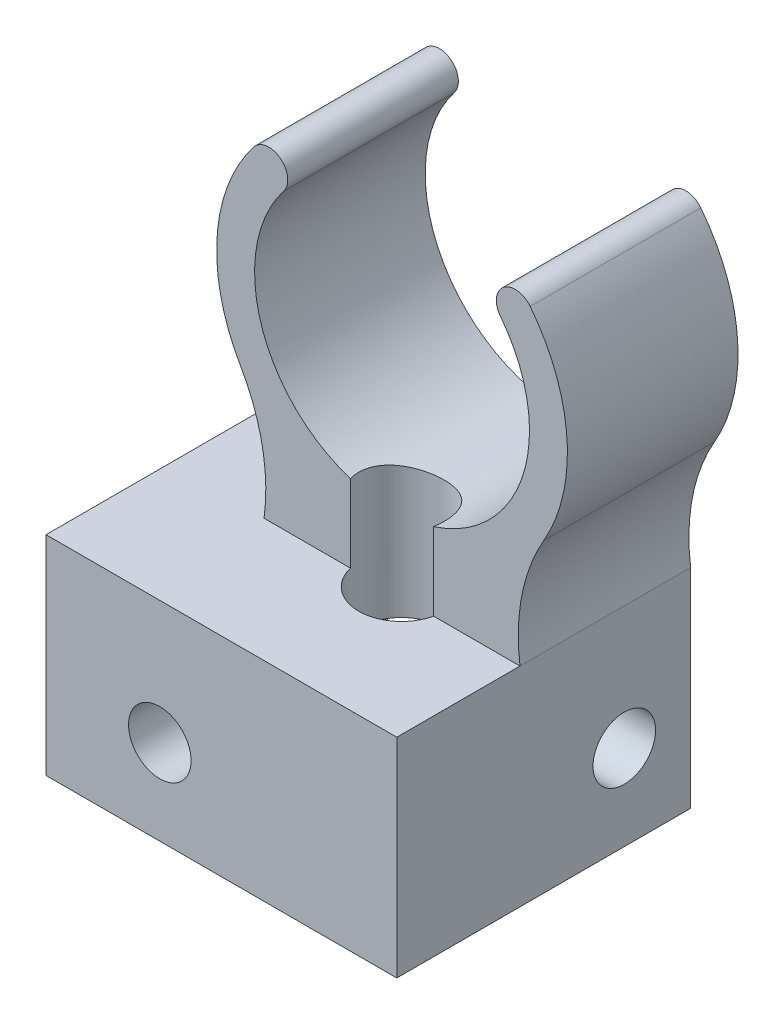
ISO-10303-21;
HEADER;
FILE_DESCRIPTION(('STEP AP214'),'2;1');
FILE_NAME('part.step','',(''),(''),'','','');
FILE_SCHEMA(('AUTOMOTIVE_DESIGN { 1 0 10303 214 1 1 1 1 }'));
ENDSEC;
DATA;
#1=APPLICATION_CONTEXT('core data for automotive mechanical design processes');
#2=APPLICATION_PROTOCOL_DEFINITION('international standard','automotive_design',2000,#1);
#3=PRODUCT_CONTEXT('',#1,'mechanical');
#4=PRODUCT('Part','Part','',(#3));
#5=PRODUCT_RELATED_PRODUCT_CATEGORY('part','',(#4));
#6=PRODUCT_DEFINITION_FORMATION('','',#4);
#7=PRODUCT_DEFINITION_CONTEXT('part definition',#1,'design');
#8=PRODUCT_DEFINITION('design','',#6,#7);
#9=PRODUCT_DEFINITION_SHAPE('','',#8);
#10=(LENGTH_UNIT() NAMED_UNIT(*) SI_UNIT(.MILLI.,.METRE.));
#11=(NAMED_UNIT(*) PLANE_ANGLE_UNIT() SI_UNIT($,.RADIAN.));
#12=(NAMED_UNIT(*) SI_UNIT($,.STERADIAN.) SOLID_ANGLE_UNIT());
#13=UNCERTAINTY_MEASURE_WITH_UNIT(LENGTH_MEASURE(1.E-05),#10,'distance_accuracy_value','');
#14=(GEOMETRIC_REPRESENTATION_CONTEXT(3) GLOBAL_UNCERTAINTY_ASSIGNED_CONTEXT((#13)) GLOBAL_UNIT_ASSIGNED_CONTEXT((#10,
#11,#12)) REPRESENTATION_CONTEXT('',''));
#15=CARTESIAN_POINT('',(0.,0.,0.));
#16=DIRECTION('',(0.,0.,1.));
#17=DIRECTION('',(1.,0.,0.));
#18=AXIS2_PLACEMENT_3D('',#15,#16,#17);
#19=CARTESIAN_POINT('',(5.95456315633577,-4.13590106472685,0.));
#20=DIRECTION('',(0.,0.,-1.));
#21=DIRECTION('',(-1.,0.,0.));
#22=AXIS2_PLACEMENT_3D('',#19,#20,#21);
#23=PLANE('',#22);
#24=DIRECTION('',(0.,1.,0.));
#25=VECTOR('',#24,1.);
#26=CARTESIAN_POINT('',(-2.5,-9.25,0.));
#27=LINE('',#26,#25);
#28=CARTESIAN_POINT('',(-2.5,-12.75,0.));
#29=VERTEX_POINT('',#28);
#30=CARTESIAN_POINT('',(-2.5,-9.25,0.));
#31=VERTEX_POINT('',#30);
#32=EDGE_CURVE('E60',#29,#31,#27,.T.);
#33=ORIENTED_EDGE('',*,*,#32,.F.);
#34=DIRECTION('',(-1.,0.,0.));
#35=VECTOR('',#34,1.);
#36=CARTESIAN_POINT('',(2.5,-12.75,0.));
#37=LINE('',#36,#35);
#38=CARTESIAN_POINT('',(2.5,-12.75,0.));
#39=VERTEX_POINT('',#38);
#40=EDGE_CURVE('E134',#39,#29,#37,.T.);
#41=ORIENTED_EDGE('',*,*,#40,.F.);
#42=DIRECTION('',(0.,-1.,0.));
#43=VECTOR('',#42,1.);
#44=CARTESIAN_POINT('',(2.5,-9.25,0.));
#45=LINE('',#44,#43);
#46=CARTESIAN_POINT('',(2.5,-9.25,0.));
#47=VERTEX_POINT('',#46);
#48=EDGE_CURVE('E510',#47,#39,#45,.T.);
#49=ORIENTED_EDGE('',*,*,#48,.F.);
#50=DIRECTION('',(1.,0.,0.));
#51=VECTOR('',#50,1.);
#52=CARTESIAN_POINT('',(2.5,-9.25,0.));
#53=LINE('',#52,#51);
#54=EDGE_CURVE('E515',#31,#47,#53,.T.);
#55=ORIENTED_EDGE('',*,*,#54,.F.);
#56=EDGE_LOOP('',(#33,#41,#49,#55));
#57=FACE_BOUND('',#56,.T.);
#58=CARTESIAN_POINT('',(-16.6580889761637,-9.64730903735411,0.));
#59=DIRECTION('',(0.,0.,-1.));
#60=DIRECTION('',(-1.,0.,0.));
#61=AXIS2_PLACEMENT_3D('',#58,#59,#60);
#62=CIRCLE('',#61,10.);
#63=CARTESIAN_POINT('',(-6.75,-11.,0.));
#64=VERTEX_POINT('',#63);
#65=CARTESIAN_POINT('',(-8.00453626127346,-4.63571992704029,0.));
#66=VERTEX_POINT('',#65);
#67=EDGE_CURVE('E118',#64,#66,#62,.F.);
#68=ORIENTED_EDGE('',*,*,#67,.T.);
#69=CARTESIAN_POINT('',(0.,0.,0.));
#70=DIRECTION('',(0.,0.,1.));
#71=DIRECTION('',(1.,0.,0.));
#72=AXIS2_PLACEMENT_3D('',#69,#70,#71);
#73=CIRCLE('',#72,9.25);
#74=CARTESIAN_POINT('',(-7.28787878787879,5.69643070467696,0.));
#75=VERTEX_POINT('',#74);
#76=EDGE_CURVE('E162',#75,#66,#73,.T.);
#77=ORIENTED_EDGE('',*,*,#76,.F.);
#78=CARTESIAN_POINT('',(-6.5,5.0806003582254,0.));
#79=DIRECTION('',(0.,0.,1.));
#80=DIRECTION('',(-1.,0.,0.));
#81=AXIS2_PLACEMENT_3D('',#78,#79,#80);
#82=CIRCLE('',#81,1.);
#83=CARTESIAN_POINT('',(-5.71212121212121,4.46477001177383,0.));
#84=VERTEX_POINT('',#83);
#85=EDGE_CURVE('E166',#84,#75,#82,.T.);
#86=ORIENTED_EDGE('',*,*,#85,.F.);
#87=CARTESIAN_POINT('',(0.,0.,0.));
#88=DIRECTION('',(0.,0.,-1.));
#89=DIRECTION('',(1.,0.,0.));
#90=AXIS2_PLACEMENT_3D('',#87,#88,#89);
#91=CIRCLE('',#90,7.25);
#92=CARTESIAN_POINT('',(5.71212121212121,4.46477001177383,0.));
#93=VERTEX_POINT('',#92);
#94=EDGE_CURVE('E155',#93,#84,#91,.T.);
#95=ORIENTED_EDGE('',*,*,#94,.F.);
#96=CARTESIAN_POINT('',(6.5,5.0806003582254,0.));
#97=DIRECTION('',(0.,0.,1.));
#98=DIRECTION('',(1.,0.,0.));
#99=AXIS2_PLACEMENT_3D('',#96,#97,#98);
#100=CIRCLE('',#99,1.);
#101=CARTESIAN_POINT('',(7.28787878787879,5.69643070467696,0.));
#102=VERTEX_POINT('',#101);
#103=EDGE_CURVE('E158',#102,#93,#100,.T.);
#104=ORIENTED_EDGE('',*,*,#103,.F.);
#105=CARTESIAN_POINT('',(8.00453626127346,-4.63571992704029,0.));
#106=VERTEX_POINT('',#105);
#107=EDGE_CURVE('E165',#106,#102,#73,.T.);
#108=ORIENTED_EDGE('',*,*,#107,.F.);
#109=CARTESIAN_POINT('',(16.6580889761637,-9.64730903735411,0.));
#110=DIRECTION('',(0.,0.,-1.));
#111=DIRECTION('',(-1.,0.,0.));
#112=AXIS2_PLACEMENT_3D('',#109,#110,#111);
#113=CIRCLE('',#112,10.);
#114=CARTESIAN_POINT('',(6.75,-11.,0.));
#115=VERTEX_POINT('',#114);
#116=EDGE_CURVE('E109',#106,#115,#113,.F.);
#117=ORIENTED_EDGE('',*,*,#116,.T.);
#118=DIRECTION('',(0.,1.,0.));
#119=VECTOR('',#118,1.);
#120=CARTESIAN_POINT('',(6.75,-11.,0.));
#121=LINE('',#120,#119);
#122=CARTESIAN_POINT('',(6.75,-22.,0.));
#123=VERTEX_POINT('',#122);
#124=EDGE_CURVE('E90',#123,#115,#121,.T.);
#125=ORIENTED_EDGE('',*,*,#124,.F.);
#126=DIRECTION('',(-1.,0.,0.));
#127=VECTOR('',#126,1.);
#128=CARTESIAN_POINT('',(6.75,-22.,0.));
#129=LINE('',#128,#127);
#130=CARTESIAN_POINT('',(4.25,-22.,0.));
#131=VERTEX_POINT('',#130);
#132=EDGE_CURVE('E97',#123,#131,#129,.T.);
#133=ORIENTED_EDGE('',*,*,#132,.T.);
#134=DIRECTION('',(0.,1.,0.));
#135=VECTOR('',#134,1.);
#136=CARTESIAN_POINT('',(4.25,-11.,0.));
#137=LINE('',#136,#135);
#138=CARTESIAN_POINT('',(4.25,-14.,0.));
#139=VERTEX_POINT('',#138);
#140=EDGE_CURVE('E114',#131,#139,#137,.T.);
#141=ORIENTED_EDGE('',*,*,#140,.T.);
#142=DIRECTION('',(1.,0.,0.));
#143=VECTOR('',#142,1.);
#144=CARTESIAN_POINT('',(-9.25,-14.,0.));
#145=LINE('',#144,#143);
#146=CARTESIAN_POINT('',(-9.25,-14.,0.));
#147=VERTEX_POINT('',#146);
#148=EDGE_CURVE('E194',#147,#139,#145,.T.);
#149=ORIENTED_EDGE('',*,*,#148,.F.);
#150=DIRECTION('',(0.,-1.,0.));
#151=VECTOR('',#150,1.);
#152=CARTESIAN_POINT('',(-9.25,-11.,0.));
#153=LINE('',#152,#151);
#154=CARTESIAN_POINT('',(-9.25,-22.,0.));
#155=VERTEX_POINT('',#154);
#156=EDGE_CURVE('E393',#147,#155,#153,.T.);
#157=ORIENTED_EDGE('',*,*,#156,.T.);
#158=DIRECTION('',(1.,0.,0.));
#159=VECTOR('',#158,1.);
#160=CARTESIAN_POINT('',(-11.75,-22.,0.));
#161=LINE('',#160,#159);
#162=CARTESIAN_POINT('',(-11.75,-22.,0.));
#163=VERTEX_POINT('',#162);
#164=EDGE_CURVE('E408',#163,#155,#161,.T.);
#165=ORIENTED_EDGE('',*,*,#164,.F.);
#166=DIRECTION('',(0.,-1.,0.));
#167=VECTOR('',#166,1.);
#168=CARTESIAN_POINT('',(-11.75,-11.,0.));
#169=LINE('',#168,#167);
#170=CARTESIAN_POINT('',(-11.75,-11.,0.));
#171=VERTEX_POINT('',#170);
#172=EDGE_CURVE('E400',#171,#163,#169,.T.);
#173=ORIENTED_EDGE('',*,*,#172,.F.);
#174=DIRECTION('',(1.,0.,0.));
#175=VECTOR('',#174,1.);
#176=CARTESIAN_POINT('',(-9.25,-11.,0.));
#177=LINE('',#176,#175);
#178=EDGE_CURVE('E201',#171,#64,#177,.T.);
#179=ORIENTED_EDGE('',*,*,#178,.T.);
#180=EDGE_LOOP('',(#68,#77,#86,#95,#104,#108,#117,#125,#133,#141,#149,#157,#165,#173,#179));
#181=FACE_BOUND('',#180,.T.);
#182=ADVANCED_FACE('F43',(#57,#181),#23,.T.);
#183=CARTESIAN_POINT('',(-5.75,-17.5,15.5));
#184=DIRECTION('',(0.,0.,-1.));
#185=DIRECTION('',(-1.,0.,0.));
#186=AXIS2_PLACEMENT_3D('',#183,#184,#185);
#187=CYLINDRICAL_SURFACE('',#186,1.65);
#188=CARTESIAN_POINT('',(-5.75,-17.5,15.5));
#189=DIRECTION('',(0.,0.,1.));
#190=DIRECTION('',(1.,0.,0.));
#191=AXIS2_PLACEMENT_3D('',#188,#189,#190);
#192=CIRCLE('',#191,1.65);
#193=CARTESIAN_POINT('',(-4.1,-17.5,15.5));
#194=VERTEX_POINT('',#193);
#195=EDGE_CURVE('E414',#194,#194,#192,.T.);
#196=ORIENTED_EDGE('',*,*,#195,.T.);
#197=EDGE_LOOP('',(#196));
#198=FACE_BOUND('',#197,.T.);
#199=CARTESIAN_POINT('',(-5.75,-17.5,13.));
#200=DIRECTION('',(0.,0.,1.));
#201=DIRECTION('',(1.,0.,0.));
#202=AXIS2_PLACEMENT_3D('',#199,#200,#201);
#203=CIRCLE('',#202,1.65);
#204=CARTESIAN_POINT('',(-4.1,-17.5,13.));
#205=VERTEX_POINT('',#204);
#206=EDGE_CURVE('E378',#205,#205,#203,.T.);
#207=ORIENTED_EDGE('',*,*,#206,.F.);
#208=EDGE_LOOP('',(#207));
#209=FACE_BOUND('',#208,.T.);
#210=ADVANCED_FACE('F229',(#198,#209),#187,.F.);
#211=CARTESIAN_POINT('',(16.6580889761637,-9.64730903735411,-5.35));
#212=DIRECTION('',(0.,0.,1.));
#213=DIRECTION('',(1.,0.,0.));
#214=AXIS2_PLACEMENT_3D('',#211,#212,#213);
#215=CYLINDRICAL_SURFACE('',#214,10.);
#216=ORIENTED_EDGE('',*,*,#116,.F.);
#217=DIRECTION('',(0.,0.,1.));
#218=VECTOR('',#217,1.);
#219=CARTESIAN_POINT('',(8.00453626127346,-4.63571992704029,-17.2277236998751));
#220=LINE('',#219,#218);
#221=CARTESIAN_POINT('',(8.00453626127346,-4.63571992704029,9.));
#222=VERTEX_POINT('',#221);
#223=EDGE_CURVE('E185',#106,#222,#220,.T.);
#224=ORIENTED_EDGE('',*,*,#223,.T.);
#225=CARTESIAN_POINT('',(16.6580889761637,-9.64730903735411,9.));
#226=DIRECTION('',(0.,0.,-1.));
#227=DIRECTION('',(-1.,0.,0.));
#228=AXIS2_PLACEMENT_3D('',#225,#226,#227);
#229=CIRCLE('',#228,10.);
#230=CARTESIAN_POINT('',(6.75,-11.,9.));
#231=VERTEX_POINT('',#230);
#232=EDGE_CURVE('E188',#231,#222,#229,.T.);
#233=ORIENTED_EDGE('',*,*,#232,.F.);
#234=DIRECTION('',(0.,0.,1.));
#235=VECTOR('',#234,1.);
#236=CARTESIAN_POINT('',(6.75,-11.,-5.35));
#237=LINE('',#236,#235);
#238=EDGE_CURVE('E47',#115,#231,#237,.T.);
#239=ORIENTED_EDGE('',*,*,#238,.F.);
#240=EDGE_LOOP('',(#216,#224,#233,#239));
#241=FACE_BOUND('',#240,.T.);
#242=ADVANCED_FACE('F232',(#241),#215,.F.);
#243=CARTESIAN_POINT('',(-6.5,5.0806003582254,9.));
#244=DIRECTION('',(0.,0.,-1.));
#245=DIRECTION('',(-1.,0.,0.));
#246=AXIS2_PLACEMENT_3D('',#243,#244,#245);
#247=CYLINDRICAL_SURFACE('',#246,1.);
#248=ORIENTED_EDGE('',*,*,#85,.T.);
#249=DIRECTION('',(0.,0.,-1.));
#250=VECTOR('',#249,1.);
#251=CARTESIAN_POINT('',(-7.28787878787879,5.69643070467696,9.));
#252=LINE('',#251,#250);
#253=CARTESIAN_POINT('',(-7.28787878787879,5.69643070467696,9.));
#254=VERTEX_POINT('',#253);
#255=EDGE_CURVE('E142',#254,#75,#252,.T.);
#256=ORIENTED_EDGE('',*,*,#255,.F.);
#257=CARTESIAN_POINT('',(-6.5,5.0806003582254,9.));
#258=DIRECTION('',(0.,0.,1.));
#259=DIRECTION('',(-1.,0.,0.));
#260=AXIS2_PLACEMENT_3D('',#257,#258,#259);
#261=CIRCLE('',#260,1.);
#262=CARTESIAN_POINT('',(-5.71212121212121,4.46477001177383,9.));
#263=VERTEX_POINT('',#262);
#264=EDGE_CURVE('E159',#263,#254,#261,.T.);
#265=ORIENTED_EDGE('',*,*,#264,.F.);
#266=DIRECTION('',(0.,0.,-1.));
#267=VECTOR('',#266,1.);
#268=CARTESIAN_POINT('',(-5.71212121212121,4.46477001177383,9.));
#269=LINE('',#268,#267);
#270=EDGE_CURVE('E151',#263,#84,#269,.T.);
#271=ORIENTED_EDGE('',*,*,#270,.T.);
#272=EDGE_LOOP('',(#248,#256,#265,#271));
#273=FACE_BOUND('',#272,.T.);
#274=ADVANCED_FACE('F273',(#273),#247,.T.);
#275=CARTESIAN_POINT('',(0.,0.,9.));
#276=DIRECTION('',(0.,0.,-1.));
#277=DIRECTION('',(-1.,0.,0.));
#278=AXIS2_PLACEMENT_3D('',#275,#276,#277);
#279=CYLINDRICAL_SURFACE('',#278,9.25);
#280=ORIENTED_EDGE('',*,*,#223,.F.);
#281=ORIENTED_EDGE('',*,*,#107,.T.);
#282=DIRECTION('',(0.,0.,-1.));
#283=VECTOR('',#282,1.);
#284=CARTESIAN_POINT('',(7.28787878787879,5.69643070467696,9.));
#285=LINE('',#284,#283);
#286=CARTESIAN_POINT('',(7.28787878787879,5.69643070467696,9.));
#287=VERTEX_POINT('',#286);
#288=EDGE_CURVE('E145',#287,#102,#285,.T.);
#289=ORIENTED_EDGE('',*,*,#288,.F.);
#290=CARTESIAN_POINT('',(0.,0.,9.));
#291=DIRECTION('',(0.,0.,1.));
#292=DIRECTION('',(1.,0.,0.));
#293=AXIS2_PLACEMENT_3D('',#290,#291,#292);
#294=CIRCLE('',#293,9.25);
#295=EDGE_CURVE('E179',#222,#287,#294,.T.);
#296=ORIENTED_EDGE('',*,*,#295,.F.);
#297=EDGE_LOOP('',(#280,#281,#289,#296));
#298=FACE_BOUND('',#297,.T.);
#299=ADVANCED_FACE('F284',(#298),#279,.T.);
#300=CARTESIAN_POINT('',(-16.6580889761637,-9.64730903735411,-5.35));
#301=DIRECTION('',(0.,0.,1.));
#302=DIRECTION('',(1.,0.,0.));
#303=AXIS2_PLACEMENT_3D('',#300,#301,#302);
#304=CYLINDRICAL_SURFACE('',#303,10.);
#305=ORIENTED_EDGE('',*,*,#67,.F.);
#306=DIRECTION('',(0.,0.,1.));
#307=VECTOR('',#306,1.);
#308=CARTESIAN_POINT('',(-6.75,-11.,-17.2277236998751));
#309=LINE('',#308,#307);
#310=CARTESIAN_POINT('',(-6.75,-11.,9.));
#311=VERTEX_POINT('',#310);
#312=EDGE_CURVE('E169',#64,#311,#309,.T.);
#313=ORIENTED_EDGE('',*,*,#312,.T.);
#314=CARTESIAN_POINT('',(-16.6580889761637,-9.64730903735412,9.));
#315=DIRECTION('',(0.,0.,-1.));
#316=DIRECTION('',(1.,0.,0.));
#317=AXIS2_PLACEMENT_3D('',#314,#315,#316);
#318=CIRCLE('',#317,10.);
#319=CARTESIAN_POINT('',(-8.00453626127346,-4.63571992704029,9.));
#320=VERTEX_POINT('',#319);
#321=EDGE_CURVE('E191',#320,#311,#318,.T.);
#322=ORIENTED_EDGE('',*,*,#321,.F.);
#323=DIRECTION('',(0.,0.,1.));
#324=VECTOR('',#323,1.);
#325=CARTESIAN_POINT('',(-8.00453626127346,-4.63571992704029,-17.2277236998751));
#326=LINE('',#325,#324);
#327=EDGE_CURVE('E184',#66,#320,#326,.T.);
#328=ORIENTED_EDGE('',*,*,#327,.F.);
#329=EDGE_LOOP('',(#305,#313,#322,#328));
#330=FACE_BOUND('',#329,.T.);
#331=ADVANCED_FACE('F281',(#330),#304,.F.);
#332=CARTESIAN_POINT('',(-3.25,2.5403001791127,9.));
#333=DIRECTION('',(0.,0.,-1.));
#334=DIRECTION('',(-1.,0.,0.));
#335=AXIS2_PLACEMENT_3D('',#332,#333,#334);
#336=PLANE('',#335);
#337=DIRECTION('',(1.,0.,0.));
#338=VECTOR('',#337,1.);
#339=CARTESIAN_POINT('',(-6.75,-11.,9.));
#340=LINE('',#339,#338);
#341=CARTESIAN_POINT('',(-2.19374109684803,-11.,9.));
#342=VERTEX_POINT('',#341);
#343=EDGE_CURVE('E196',#311,#342,#340,.T.);
#344=ORIENTED_EDGE('',*,*,#343,.T.);
#345=DIRECTION('',(0.,-1.,0.));
#346=VECTOR('',#345,1.);
#347=CARTESIAN_POINT('',(-2.19374109684803,6.0816003582254,9.));
#348=LINE('',#347,#346);
#349=CARTESIAN_POINT('',(-2.19374109684803,-6.91013748054263,9.));
#350=VERTEX_POINT('',#349);
#351=EDGE_CURVE('E431',#350,#342,#348,.T.);
#352=ORIENTED_EDGE('',*,*,#351,.F.);
#353=CARTESIAN_POINT('',(0.,0.,9.));
#354=DIRECTION('',(0.,0.,-1.));
#355=DIRECTION('',(1.,0.,0.));
#356=AXIS2_PLACEMENT_3D('',#353,#354,#355);
#357=CIRCLE('',#356,7.25);
#358=EDGE_CURVE('E172',#350,#263,#357,.T.);
#359=ORIENTED_EDGE('',*,*,#358,.T.);
#360=ORIENTED_EDGE('',*,*,#264,.T.);
#361=EDGE_CURVE('E176',#254,#320,#294,.T.);
#362=ORIENTED_EDGE('',*,*,#361,.T.);
#363=ORIENTED_EDGE('',*,*,#321,.T.);
#364=EDGE_LOOP('',(#344,#352,#359,#360,#362,#363));
#365=FACE_BOUND('',#364,.T.);
#366=ADVANCED_FACE('F283',(#365),#336,.F.);
#367=CARTESIAN_POINT('',(0.,6.0816003582254,8.5));
#368=DIRECTION('',(0.,-1.,0.));
#369=DIRECTION('',(1.,0.,0.));
#370=AXIS2_PLACEMENT_3D('',#367,#368,#369);
#371=CYLINDRICAL_SURFACE('',#370,2.25);
#372=CARTESIAN_POINT('',(0.,-14.,8.5));
#373=DIRECTION('',(0.,-1.,0.));
#374=DIRECTION('',(1.,0.,0.));
#375=AXIS2_PLACEMENT_3D('',#372,#373,#374);
#376=CIRCLE('',#375,2.25);
#377=CARTESIAN_POINT('',(2.25,-14.,8.5));
#378=VERTEX_POINT('',#377);
#379=EDGE_CURVE('E422',#378,#378,#376,.T.);
#380=ORIENTED_EDGE('',*,*,#379,.T.);
#381=EDGE_LOOP('',(#380));
#382=FACE_BOUND('',#381,.T.);
#383=CARTESIAN_POINT('',(2.19374109684803,-6.91013748054263,9.));
#384=CARTESIAN_POINT('',(2.2071878763264,-6.9058629545295,8.94103464728746));
#385=CARTESIAN_POINT('',(2.21825467540277,-6.90231180586618,8.88147405945985));
#386=CARTESIAN_POINT('',(2.23556086648634,-6.89672899914491,8.76158668351088));
#387=CARTESIAN_POINT('',(2.24180034541183,-6.89469731372831,8.70125990920496));
#388=CARTESIAN_POINT('',(2.24937751265604,-6.89222842998436,8.58038074963204));
#389=CARTESIAN_POINT('',(2.25072477610182,-6.89178811700383,8.51982903751698));
#390=CARTESIAN_POINT('',(2.24854021946834,-6.89250056624851,8.3988413907536));
#391=CARTESIAN_POINT('',(2.24500857488242,-6.89365327117318,8.33840545201923));
#392=CARTESIAN_POINT('',(2.22711131276882,-6.8994690686885,8.15784313406396));
#393=CARTESIAN_POINT('',(2.20544561432265,-6.90648912581003,8.03842582895325));
#394=CARTESIAN_POINT('',(2.14341369870189,-6.92598797234484,7.8051042488775));
#395=CARTESIAN_POINT('',(2.10304581068597,-6.9384672494757,7.69120046749146));
#396=CARTESIAN_POINT('',(2.0042850304718,-6.96764052720252,7.47036666976525));
#397=CARTESIAN_POINT('',(1.94567588259289,-6.98438463127149,7.36354003961246));
#398=CARTESIAN_POINT('',(1.81223415359198,-7.02019005558939,7.16095755265948));
#399=CARTESIAN_POINT('',(1.73739491442136,-7.03925232540252,7.06520626407372));
#400=CARTESIAN_POINT('',(1.56966027231202,-7.07858741220667,6.88300492764522));
#401=CARTESIAN_POINT('',(1.47610647473906,-7.09887621681128,6.79716325417896));
#402=CARTESIAN_POINT('',(1.27566835087453,-7.13761686654392,6.64225599134772));
#403=CARTESIAN_POINT('',(1.16878416702953,-7.15606873129743,6.5731902227411));
#404=CARTESIAN_POINT('',(0.943668275370852,-7.18922823367605,6.45345536238316));
#405=CARTESIAN_POINT('',(0.825365824017812,-7.20391015250896,6.40291168067875));
#406=CARTESIAN_POINT('',(0.581373549995906,-7.22769004812993,6.32261942364704));
#407=CARTESIAN_POINT('',(0.455685785187521,-7.23678957239982,6.29286508503919));
#408=CARTESIAN_POINT('',(0.205688950473652,-7.24812006625545,6.25599934999144));
#409=CARTESIAN_POINT('',(0.0815130760723774,-7.25060196852546,6.24806036601382));
#410=CARTESIAN_POINT('',(-0.166401582241811,-7.24914954463106,6.25274037825404));
#411=CARTESIAN_POINT('',(-0.29014042443023,-7.24521610898573,6.26535652119519));
#412=CARTESIAN_POINT('',(-0.530622807088502,-7.23153612575385,6.31012587905792));
#413=CARTESIAN_POINT('',(-0.647462655723476,-7.22192967739154,6.34180857930247));
#414=CARTESIAN_POINT('',(-0.874139151738475,-7.19801234550353,6.42325010579229));
#415=CARTESIAN_POINT('',(-0.983975071701241,-7.18370097427884,6.47301080600812));
#416=CARTESIAN_POINT('',(-1.19655794980648,-7.15140569444166,6.59058414432288));
#417=CARTESIAN_POINT('',(-1.29906101521033,-7.13333938308196,6.65881452786711));
#418=CARTESIAN_POINT('',(-1.49144817577087,-7.09561203539172,6.81087975440779));
#419=CARTESIAN_POINT('',(-1.58132795507123,-7.07595045725245,6.89471991165568));
#420=CARTESIAN_POINT('',(-1.74952125450974,-7.03629441059367,7.07948005877561));
#421=CARTESIAN_POINT('',(-1.82725078623368,-7.01631661939576,7.18093647789479));
#422=CARTESIAN_POINT('',(-1.96461056635269,-6.97910361312422,7.39588637529811));
#423=CARTESIAN_POINT('',(-2.02424412331603,-6.96186789697919,7.50937764806924));
#424=CARTESIAN_POINT('',(-2.12330312409141,-6.93229820738975,7.74481242956322));
#425=CARTESIAN_POINT('',(-2.16282751026598,-6.91994030259355,7.86671113659563));
#426=CARTESIAN_POINT('',(-2.22065402232908,-6.90160409861676,8.11589529870101));
#427=CARTESIAN_POINT('',(-2.23896458751105,-6.89562326258281,8.2431785907733));
#428=CARTESIAN_POINT('',(-2.25235578715861,-6.89125641454198,8.47655675306101));
#429=CARTESIAN_POINT('',(-2.25095997114261,-6.89171823352986,8.58243486197695));
#430=CARTESIAN_POINT('',(-2.23776924472285,-6.8960062664288,8.74017131413235));
#431=CARTESIAN_POINT('',(-2.23151735311219,-6.89803660659588,8.79259409576107));
#432=CARTESIAN_POINT('',(-2.21535842229283,-6.90324216898914,8.89682293197231));
#433=CARTESIAN_POINT('',(-2.20545091732476,-6.90641753710142,8.94862890709932));
#434=CARTESIAN_POINT('',(-2.19374109684803,-6.91013748054263,9.));
#435=B_SPLINE_CURVE_WITH_KNOTS('',3,(#383,#384,#385,#386,#387,#388,#389,#390,#391,#392,#393,
#394,#395,#396,#397,#398,#399,#400,#401,#402,#403,#404,#405,#406,#407,#408,#409,#410,#411,#412,
#413,#414,#415,#416,#417,#418,#419,#420,#421,#422,#423,#424,#425,#426,#427,#428,#429,#430,#431,
#432,#433,#434),.UNSPECIFIED.,.F.,.F.,(4,2,2,2,2,2,2,2,2,2,2,2,2,2,2,2,2,2,2,2,2,2,2,2,2,4),(0.,
0.181836072470973,0.363668870817822,0.545145590523874,0.726615782719335,1.08944806590521,
1.45231277054131,1.81965467529651,2.18714756025137,2.5710938922725,2.95503612185023,
3.34153192276339,3.72792053565914,4.0994343710233,4.4708966405924,4.83354788041264,
5.19623672349374,5.56793566380874,5.93976137889858,6.32601210561999,6.71219216977942,
7.09645329224342,7.48056149519752,7.79701470389792,7.95538840729058,8.11378229594751),.UNSPECIFIED.);
#436=CARTESIAN_POINT('',(2.19374109684803,-6.91013748054263,9.));
#437=VERTEX_POINT('',#436);
#438=EDGE_CURVE('E203',#437,#350,#435,.T.);
#439=ORIENTED_EDGE('',*,*,#438,.T.);
#440=ORIENTED_EDGE('',*,*,#351,.T.);
#441=CARTESIAN_POINT('',(0.,-11.,8.5));
#442=DIRECTION('',(0.,-1.,0.));
#443=DIRECTION('',(1.,0.,0.));
#444=AXIS2_PLACEMENT_3D('',#441,#442,#443);
#445=CIRCLE('',#444,2.25);
#446=CARTESIAN_POINT('',(2.19374109684803,-11.,9.));
#447=VERTEX_POINT('',#446);
#448=EDGE_CURVE('E429',#342,#447,#445,.F.);
#449=ORIENTED_EDGE('',*,*,#448,.T.);
#450=DIRECTION('',(0.,-1.,0.));
#451=VECTOR('',#450,1.);
#452=CARTESIAN_POINT('',(2.19374109684803,6.0816003582254,9.));
#453=LINE('',#452,#451);
#454=EDGE_CURVE('E222',#447,#437,#453,.F.);
#455=ORIENTED_EDGE('',*,*,#454,.T.);
#456=EDGE_LOOP('',(#439,#440,#449,#455));
#457=FACE_BOUND('',#456,.T.);
#458=ADVANCED_FACE('F224',(#382,#457),#371,.F.);
#459=CARTESIAN_POINT('',(5.71212121212121,4.46477001177383,9.));
#460=VERTEX_POINT('',#459);
#461=EDGE_CURVE('E154',#460,#437,#357,.T.);
#462=ORIENTED_EDGE('',*,*,#461,.T.);
#463=ORIENTED_EDGE('',*,*,#454,.F.);
#464=EDGE_CURVE('E195',#447,#231,#340,.T.);
#465=ORIENTED_EDGE('',*,*,#464,.T.);
#466=ORIENTED_EDGE('',*,*,#232,.T.);
#467=ORIENTED_EDGE('',*,*,#295,.T.);
#468=CARTESIAN_POINT('',(6.5,5.0806003582254,9.));
#469=DIRECTION('',(0.,0.,1.));
#470=DIRECTION('',(1.,0.,0.));
#471=AXIS2_PLACEMENT_3D('',#468,#469,#470);
#472=CIRCLE('',#471,1.);
#473=EDGE_CURVE('E173',#287,#460,#472,.T.);
#474=ORIENTED_EDGE('',*,*,#473,.T.);
#475=EDGE_LOOP('',(#462,#463,#465,#466,#467,#474));
#476=FACE_BOUND('',#475,.T.);
#477=ADVANCED_FACE('F277',(#476),#336,.F.);
#478=CARTESIAN_POINT('',(6.75,-11.,-5.35));
#479=DIRECTION('',(-1.,0.,0.));
#480=DIRECTION('',(0.,0.,1.));
#481=AXIS2_PLACEMENT_3D('',#478,#479,#480);
#482=PLANE('',#481);
#483=CARTESIAN_POINT('',(6.75,-17.5,3.5));
#484=DIRECTION('',(1.,0.,0.));
#485=DIRECTION('',(0.,1.,0.));
#486=AXIS2_PLACEMENT_3D('',#483,#484,#485);
#487=CIRCLE('',#486,1.65);
#488=CARTESIAN_POINT('',(6.75,-15.85,3.5));
#489=VERTEX_POINT('',#488);
#490=EDGE_CURVE('E52',#489,#489,#487,.T.);
#491=ORIENTED_EDGE('',*,*,#490,.F.);
#492=EDGE_LOOP('',(#491));
#493=FACE_BOUND('',#492,.T.);
#494=ORIENTED_EDGE('',*,*,#124,.T.);
#495=ORIENTED_EDGE('',*,*,#238,.T.);
#496=DIRECTION('',(0.,0.,1.));
#497=VECTOR('',#496,1.);
#498=CARTESIAN_POINT('',(6.75,-11.,15.5));
#499=LINE('',#498,#497);
#500=CARTESIAN_POINT('',(6.75,-11.,15.5));
#501=VERTEX_POINT('',#500);
#502=EDGE_CURVE('E102',#231,#501,#499,.T.);
#503=ORIENTED_EDGE('',*,*,#502,.T.);
#504=DIRECTION('',(0.,-1.,0.));
#505=VECTOR('',#504,1.);
#506=CARTESIAN_POINT('',(6.75,-11.,15.5));
#507=LINE('',#506,#505);
#508=CARTESIAN_POINT('',(6.75,-22.,15.5));
#509=VERTEX_POINT('',#508);
#510=EDGE_CURVE('E94',#501,#509,#507,.T.);
#511=ORIENTED_EDGE('',*,*,#510,.T.);
#512=DIRECTION('',(0.,0.,-1.));
#513=VECTOR('',#512,1.);
#514=CARTESIAN_POINT('',(6.75,-22.,15.5));
#515=LINE('',#514,#513);
#516=EDGE_CURVE('E85',#509,#123,#515,.T.);
#517=ORIENTED_EDGE('',*,*,#516,.T.);
#518=EDGE_LOOP('',(#494,#495,#503,#511,#517));
#519=FACE_BOUND('',#518,.T.);
#520=ADVANCED_FACE('F86',(#493,#519),#482,.F.);
#521=CARTESIAN_POINT('',(0.,0.,15.5));
#522=DIRECTION('',(0.,0.,1.));
#523=DIRECTION('',(1.,0.,0.));
#524=AXIS2_PLACEMENT_3D('',#521,#522,#523);
#525=PLANE('',#524);
#526=ORIENTED_EDGE('',*,*,#195,.F.);
#527=EDGE_LOOP('',(#526));
#528=FACE_BOUND('',#527,.T.);
#529=DIRECTION('',(1.,0.,0.));
#530=VECTOR('',#529,1.);
#531=CARTESIAN_POINT('',(0.,-22.,15.5));
#532=LINE('',#531,#530);
#533=CARTESIAN_POINT('',(-11.75,-22.,15.5));
#534=VERTEX_POINT('',#533);
#535=EDGE_CURVE('E420',#534,#509,#532,.T.);
#536=ORIENTED_EDGE('',*,*,#535,.T.);
#537=ORIENTED_EDGE('',*,*,#510,.F.);
#538=DIRECTION('',(-1.,0.,0.));
#539=VECTOR('',#538,1.);
#540=CARTESIAN_POINT('',(0.,-11.,15.5));
#541=LINE('',#540,#539);
#542=CARTESIAN_POINT('',(-11.75,-11.,15.5));
#543=VERTEX_POINT('',#542);
#544=EDGE_CURVE('E418',#501,#543,#541,.T.);
#545=ORIENTED_EDGE('',*,*,#544,.T.);
#546=DIRECTION('',(0.,1.,0.));
#547=VECTOR('',#546,1.);
#548=CARTESIAN_POINT('',(-11.75,-11.,15.5));
#549=LINE('',#548,#547);
#550=EDGE_CURVE('E405',#534,#543,#549,.T.);
#551=ORIENTED_EDGE('',*,*,#550,.F.);
#552=EDGE_LOOP('',(#536,#537,#545,#551));
#553=FACE_BOUND('',#552,.T.);
#554=ADVANCED_FACE('F242',(#528,#553),#525,.T.);
#555=CARTESIAN_POINT('',(-11.75,-17.5,3.5));
#556=DIRECTION('',(1.,0.,0.));
#557=DIRECTION('',(0.,1.,0.));
#558=AXIS2_PLACEMENT_3D('',#555,#556,#557);
#559=CYLINDRICAL_SURFACE('',#558,1.65);
#560=CARTESIAN_POINT('',(-11.75,-17.5,3.5));
#561=DIRECTION('',(-1.,0.,0.));
#562=DIRECTION('',(0.,-1.,0.));
#563=AXIS2_PLACEMENT_3D('',#560,#561,#562);
#564=CIRCLE('',#563,1.65);
#565=CARTESIAN_POINT('',(-11.75,-19.15,3.5));
#566=VERTEX_POINT('',#565);
#567=EDGE_CURVE('E390',#566,#566,#564,.T.);
#568=ORIENTED_EDGE('',*,*,#567,.T.);
#569=EDGE_LOOP('',(#568));
#570=FACE_BOUND('',#569,.T.);
#571=CARTESIAN_POINT('',(-9.25,-17.5,3.5));
#572=DIRECTION('',(-1.,0.,0.));
#573=DIRECTION('',(0.,-1.,0.));
#574=AXIS2_PLACEMENT_3D('',#571,#572,#573);
#575=CIRCLE('',#574,1.65);
#576=CARTESIAN_POINT('',(-9.25,-19.15,3.5));
#577=VERTEX_POINT('',#576);
#578=EDGE_CURVE('E103',#577,#577,#575,.T.);
#579=ORIENTED_EDGE('',*,*,#578,.F.);
#580=EDGE_LOOP('',(#579));
#581=FACE_BOUND('',#580,.T.);
#582=ADVANCED_FACE('F245',(#570,#581),#559,.F.);
#583=CARTESIAN_POINT('',(6.75,-17.5,3.5));
#584=DIRECTION('',(-1.,0.,0.));
#585=DIRECTION('',(0.,-1.,0.));
#586=AXIS2_PLACEMENT_3D('',#583,#584,#585);
#587=CYLINDRICAL_SURFACE('',#586,1.65);
#588=ORIENTED_EDGE('',*,*,#490,.T.);
#589=EDGE_LOOP('',(#588));
#590=FACE_BOUND('',#589,.T.);
#591=CARTESIAN_POINT('',(4.25,-17.5,3.5));
#592=DIRECTION('',(1.,0.,0.));
#593=DIRECTION('',(0.,1.,0.));
#594=AXIS2_PLACEMENT_3D('',#591,#592,#593);
#595=CIRCLE('',#594,1.65);
#596=CARTESIAN_POINT('',(4.25,-15.85,3.5));
#597=VERTEX_POINT('',#596);
#598=EDGE_CURVE('E11',#597,#597,#595,.T.);
#599=ORIENTED_EDGE('',*,*,#598,.F.);
#600=EDGE_LOOP('',(#599));
#601=FACE_BOUND('',#600,.T.);
#602=ADVANCED_FACE('F240',(#590,#601),#587,.F.);
#603=CARTESIAN_POINT('',(0.,0.,13.));
#604=DIRECTION('',(0.,0.,1.));
#605=DIRECTION('',(1.,0.,0.));
#606=AXIS2_PLACEMENT_3D('',#603,#604,#605);
#607=PLANE('',#606);
#608=DIRECTION('',(-1.,0.,0.));
#609=VECTOR('',#608,1.);
#610=CARTESIAN_POINT('',(-9.25,-14.,13.));
#611=LINE('',#610,#609);
#612=CARTESIAN_POINT('',(4.25,-14.,13.));
#613=VERTEX_POINT('',#612);
#614=CARTESIAN_POINT('',(-9.25,-14.,13.));
#615=VERTEX_POINT('',#614);
#616=EDGE_CURVE('E210',#613,#615,#611,.T.);
#617=ORIENTED_EDGE('',*,*,#616,.F.);
#618=DIRECTION('',(0.,-1.,0.));
#619=VECTOR('',#618,1.);
#620=CARTESIAN_POINT('',(4.25,0.,13.));
#621=LINE('',#620,#619);
#622=CARTESIAN_POINT('',(4.25,-22.,13.));
#623=VERTEX_POINT('',#622);
#624=EDGE_CURVE('E375',#613,#623,#621,.T.);
#625=ORIENTED_EDGE('',*,*,#624,.T.);
#626=DIRECTION('',(1.,0.,0.));
#627=VECTOR('',#626,1.);
#628=CARTESIAN_POINT('',(0.,-22.,13.));
#629=LINE('',#628,#627);
#630=CARTESIAN_POINT('',(-9.25,-22.,13.));
#631=VERTEX_POINT('',#630);
#632=EDGE_CURVE('E417',#631,#623,#629,.T.);
#633=ORIENTED_EDGE('',*,*,#632,.F.);
#634=DIRECTION('',(0.,-1.,0.));
#635=VECTOR('',#634,1.);
#636=CARTESIAN_POINT('',(-9.25,0.,13.));
#637=LINE('',#636,#635);
#638=EDGE_CURVE('E379',#615,#631,#637,.T.);
#639=ORIENTED_EDGE('',*,*,#638,.F.);
#640=EDGE_LOOP('',(#617,#625,#633,#639));
#641=FACE_BOUND('',#640,.T.);
#642=ORIENTED_EDGE('',*,*,#206,.T.);
#643=EDGE_LOOP('',(#642));
#644=FACE_BOUND('',#643,.T.);
#645=ADVANCED_FACE('F237',(#641,#644),#607,.F.);
#646=CARTESIAN_POINT('',(0.,-22.,15.5));
#647=DIRECTION('',(0.,1.,0.));
#648=DIRECTION('',(0.,0.,1.));
#649=AXIS2_PLACEMENT_3D('',#646,#647,#648);
#650=PLANE('',#649);
#651=ORIENTED_EDGE('',*,*,#632,.T.);
#652=DIRECTION('',(0.,0.,-1.));
#653=VECTOR('',#652,1.);
#654=CARTESIAN_POINT('',(4.25,-22.,15.5));
#655=LINE('',#654,#653);
#656=EDGE_CURVE('E69',#623,#131,#655,.T.);
#657=ORIENTED_EDGE('',*,*,#656,.T.);
#658=ORIENTED_EDGE('',*,*,#132,.F.);
#659=ORIENTED_EDGE('',*,*,#516,.F.);
#660=ORIENTED_EDGE('',*,*,#535,.F.);
#661=DIRECTION('',(0.,0.,1.));
#662=VECTOR('',#661,1.);
#663=CARTESIAN_POINT('',(-11.75,-22.,0.));
#664=LINE('',#663,#662);
#665=EDGE_CURVE('E402',#163,#534,#664,.T.);
#666=ORIENTED_EDGE('',*,*,#665,.F.);
#667=ORIENTED_EDGE('',*,*,#164,.T.);
#668=DIRECTION('',(0.,0.,1.));
#669=VECTOR('',#668,1.);
#670=CARTESIAN_POINT('',(-9.25,-22.,0.));
#671=LINE('',#670,#669);
#672=EDGE_CURVE('E399',#155,#631,#671,.T.);
#673=ORIENTED_EDGE('',*,*,#672,.T.);
#674=EDGE_LOOP('',(#651,#657,#658,#659,#660,#666,#667,#673));
#675=FACE_BOUND('',#674,.T.);
#676=ADVANCED_FACE('F98',(#675),#650,.F.);
#677=CARTESIAN_POINT('',(6.75,-14.,-5.35));
#678=DIRECTION('',(0.,1.,0.));
#679=DIRECTION('',(-1.,0.,0.));
#680=AXIS2_PLACEMENT_3D('',#677,#678,#679);
#681=PLANE('',#680);
#682=ORIENTED_EDGE('',*,*,#379,.F.);
#683=EDGE_LOOP('',(#682));
#684=FACE_BOUND('',#683,.T.);
#685=ORIENTED_EDGE('',*,*,#148,.T.);
#686=DIRECTION('',(0.,0.,1.));
#687=VECTOR('',#686,1.);
#688=CARTESIAN_POINT('',(4.25,-14.,13.));
#689=LINE('',#688,#687);
#690=EDGE_CURVE('E204',#139,#613,#689,.T.);
#691=ORIENTED_EDGE('',*,*,#690,.T.);
#692=ORIENTED_EDGE('',*,*,#616,.T.);
#693=DIRECTION('',(0.,0.,-1.));
#694=VECTOR('',#693,1.);
#695=CARTESIAN_POINT('',(-9.25,-14.,13.));
#696=LINE('',#695,#694);
#697=EDGE_CURVE('E207',#615,#147,#696,.T.);
#698=ORIENTED_EDGE('',*,*,#697,.T.);
#699=EDGE_LOOP('',(#685,#691,#692,#698));
#700=FACE_BOUND('',#699,.T.);
#701=ADVANCED_FACE('F236',(#684,#700),#681,.F.);
#702=CARTESIAN_POINT('',(4.25,0.,0.));
#703=DIRECTION('',(1.,0.,0.));
#704=DIRECTION('',(0.,1.,0.));
#705=AXIS2_PLACEMENT_3D('',#702,#703,#704);
#706=PLANE('',#705);
#707=ORIENTED_EDGE('',*,*,#690,.F.);
#708=ORIENTED_EDGE('',*,*,#140,.F.);
#709=ORIENTED_EDGE('',*,*,#656,.F.);
#710=ORIENTED_EDGE('',*,*,#624,.F.);
#711=EDGE_LOOP('',(#707,#708,#709,#710));
#712=FACE_BOUND('',#711,.T.);
#713=ORIENTED_EDGE('',*,*,#598,.T.);
#714=EDGE_LOOP('',(#713));
#715=FACE_BOUND('',#714,.T.);
#716=ADVANCED_FACE('F251',(#712,#715),#706,.F.);
#717=CARTESIAN_POINT('',(-9.25,0.,0.));
#718=DIRECTION('',(1.,0.,0.));
#719=DIRECTION('',(0.,1.,0.));
#720=AXIS2_PLACEMENT_3D('',#717,#718,#719);
#721=PLANE('',#720);
#722=ORIENTED_EDGE('',*,*,#156,.F.);
#723=ORIENTED_EDGE('',*,*,#697,.F.);
#724=ORIENTED_EDGE('',*,*,#638,.T.);
#725=ORIENTED_EDGE('',*,*,#672,.F.);
#726=EDGE_LOOP('',(#722,#723,#724,#725));
#727=FACE_BOUND('',#726,.T.);
#728=ORIENTED_EDGE('',*,*,#578,.T.);
#729=EDGE_LOOP('',(#728));
#730=FACE_BOUND('',#729,.T.);
#731=ADVANCED_FACE('F247',(#727,#730),#721,.T.);
#732=CARTESIAN_POINT('',(0.,-11.,0.));
#733=DIRECTION('',(0.,-1.,0.));
#734=DIRECTION('',(1.,0.,0.));
#735=AXIS2_PLACEMENT_3D('',#732,#733,#734);
#736=PLANE('',#735);
#737=ORIENTED_EDGE('',*,*,#464,.F.);
#738=ORIENTED_EDGE('',*,*,#448,.F.);
#739=ORIENTED_EDGE('',*,*,#343,.F.);
#740=ORIENTED_EDGE('',*,*,#312,.F.);
#741=ORIENTED_EDGE('',*,*,#178,.F.);
#742=DIRECTION('',(0.,0.,-1.));
#743=VECTOR('',#742,1.);
#744=CARTESIAN_POINT('',(-11.75,-11.,0.));
#745=LINE('',#744,#743);
#746=EDGE_CURVE('E396',#543,#171,#745,.T.);
#747=ORIENTED_EDGE('',*,*,#746,.F.);
#748=ORIENTED_EDGE('',*,*,#544,.F.);
#749=ORIENTED_EDGE('',*,*,#502,.F.);
#750=EDGE_LOOP('',(#737,#738,#739,#740,#741,#747,#748,#749));
#751=FACE_BOUND('',#750,.T.);
#752=ADVANCED_FACE('F250',(#751),#736,.F.);
#753=CARTESIAN_POINT('',(-11.75,0.,0.));
#754=DIRECTION('',(1.,0.,0.));
#755=DIRECTION('',(0.,1.,0.));
#756=AXIS2_PLACEMENT_3D('',#753,#754,#755);
#757=PLANE('',#756);
#758=ORIENTED_EDGE('',*,*,#746,.T.);
#759=ORIENTED_EDGE('',*,*,#172,.T.);
#760=ORIENTED_EDGE('',*,*,#665,.T.);
#761=ORIENTED_EDGE('',*,*,#550,.T.);
#762=EDGE_LOOP('',(#758,#759,#760,#761));
#763=FACE_BOUND('',#762,.T.);
#764=ORIENTED_EDGE('',*,*,#567,.F.);
#765=EDGE_LOOP('',(#764));
#766=FACE_BOUND('',#765,.T.);
#767=ADVANCED_FACE('F253',(#763,#766),#757,.F.);
#768=CARTESIAN_POINT('',(0.,0.,-22.1540115623508));
#769=DIRECTION('',(0.,0.,1.));
#770=DIRECTION('',(1.,0.,0.));
#771=AXIS2_PLACEMENT_3D('',#768,#769,#770);
#772=CYLINDRICAL_SURFACE('',#771,7.25);
#773=DIRECTION('',(0.,0.,-1.));
#774=VECTOR('',#773,1.);
#775=CARTESIAN_POINT('',(5.71212121212121,4.46477001177383,9.));
#776=LINE('',#775,#774);
#777=EDGE_CURVE('E148',#460,#93,#776,.T.);
#778=ORIENTED_EDGE('',*,*,#777,.T.);
#779=ORIENTED_EDGE('',*,*,#94,.T.);
#780=ORIENTED_EDGE('',*,*,#270,.F.);
#781=ORIENTED_EDGE('',*,*,#358,.F.);
#782=ORIENTED_EDGE('',*,*,#438,.F.);
#783=ORIENTED_EDGE('',*,*,#461,.F.);
#784=EDGE_LOOP('',(#778,#779,#780,#781,#782,#783));
#785=FACE_BOUND('',#784,.T.);
#786=ADVANCED_FACE('F45',(#785),#772,.F.);
#787=CARTESIAN_POINT('',(6.5,5.0806003582254,9.));
#788=DIRECTION('',(0.,0.,-1.));
#789=DIRECTION('',(-1.,0.,0.));
#790=AXIS2_PLACEMENT_3D('',#787,#788,#789);
#791=CYLINDRICAL_SURFACE('',#790,1.);
#792=ORIENTED_EDGE('',*,*,#103,.T.);
#793=ORIENTED_EDGE('',*,*,#777,.F.);
#794=ORIENTED_EDGE('',*,*,#473,.F.);
#795=ORIENTED_EDGE('',*,*,#288,.T.);
#796=EDGE_LOOP('',(#792,#793,#794,#795));
#797=FACE_BOUND('',#796,.T.);
#798=ADVANCED_FACE('F447',(#797),#791,.T.);
#799=ORIENTED_EDGE('',*,*,#76,.T.);
#800=ORIENTED_EDGE('',*,*,#327,.T.);
#801=ORIENTED_EDGE('',*,*,#361,.F.);
#802=ORIENTED_EDGE('',*,*,#255,.T.);
#803=EDGE_LOOP('',(#799,#800,#801,#802));
#804=FACE_BOUND('',#803,.T.);
#805=ADVANCED_FACE('F270',(#804),#279,.T.);
#806=CARTESIAN_POINT('',(-2.5,-9.25,2.3));
#807=DIRECTION('',(-1.,0.,0.));
#808=DIRECTION('',(0.,-1.,0.));
#809=AXIS2_PLACEMENT_3D('',#806,#807,#808);
#810=PLANE('',#809);
#811=ORIENTED_EDGE('',*,*,#32,.T.);
#812=DIRECTION('',(0.,0.,-1.));
#813=VECTOR('',#812,1.);
#814=CARTESIAN_POINT('',(-2.5,-9.25,2.3));
#815=LINE('',#814,#813);
#816=CARTESIAN_POINT('',(-2.5,-9.25,2.3));
#817=VERTEX_POINT('',#816);
#818=EDGE_CURVE('E139',#817,#31,#815,.T.);
#819=ORIENTED_EDGE('',*,*,#818,.F.);
#820=DIRECTION('',(0.,1.,0.));
#821=VECTOR('',#820,1.);
#822=CARTESIAN_POINT('',(-2.5,-9.25,2.3));
#823=LINE('',#822,#821);
#824=CARTESIAN_POINT('',(-2.5,-12.75,2.3));
#825=VERTEX_POINT('',#824);
#826=EDGE_CURVE('E500',#825,#817,#823,.T.);
#827=ORIENTED_EDGE('',*,*,#826,.F.);
#828=DIRECTION('',(0.,0.,-1.));
#829=VECTOR('',#828,1.);
#830=CARTESIAN_POINT('',(-2.5,-12.75,2.3));
#831=LINE('',#830,#829);
#832=EDGE_CURVE('E119',#825,#29,#831,.T.);
#833=ORIENTED_EDGE('',*,*,#832,.T.);
#834=EDGE_LOOP('',(#811,#819,#827,#833));
#835=FACE_BOUND('',#834,.T.);
#836=ADVANCED_FACE('F269',(#835),#810,.F.);
#837=CARTESIAN_POINT('',(2.5,-12.75,2.3));
#838=DIRECTION('',(0.,-1.,0.));
#839=DIRECTION('',(0.,0.,-1.));
#840=AXIS2_PLACEMENT_3D('',#837,#838,#839);
#841=PLANE('',#840);
#842=ORIENTED_EDGE('',*,*,#40,.T.);
#843=ORIENTED_EDGE('',*,*,#832,.F.);
#844=DIRECTION('',(-1.,0.,0.));
#845=VECTOR('',#844,1.);
#846=CARTESIAN_POINT('',(2.5,-12.75,2.3));
#847=LINE('',#846,#845);
#848=CARTESIAN_POINT('',(2.5,-12.75,2.3));
#849=VERTEX_POINT('',#848);
#850=EDGE_CURVE('E141',#849,#825,#847,.T.);
#851=ORIENTED_EDGE('',*,*,#850,.F.);
#852=DIRECTION('',(0.,0.,-1.));
#853=VECTOR('',#852,1.);
#854=CARTESIAN_POINT('',(2.5,-12.75,2.3));
#855=LINE('',#854,#853);
#856=EDGE_CURVE('E124',#849,#39,#855,.T.);
#857=ORIENTED_EDGE('',*,*,#856,.T.);
#858=EDGE_LOOP('',(#842,#843,#851,#857));
#859=FACE_BOUND('',#858,.T.);
#860=ADVANCED_FACE('F479',(#859),#841,.F.);
#861=CARTESIAN_POINT('',(2.5,-9.25,2.3));
#862=DIRECTION('',(1.,0.,0.));
#863=DIRECTION('',(0.,1.,0.));
#864=AXIS2_PLACEMENT_3D('',#861,#862,#863);
#865=PLANE('',#864);
#866=ORIENTED_EDGE('',*,*,#48,.T.);
#867=ORIENTED_EDGE('',*,*,#856,.F.);
#868=DIRECTION('',(0.,-1.,0.));
#869=VECTOR('',#868,1.);
#870=CARTESIAN_POINT('',(2.5,-9.25,2.3));
#871=LINE('',#870,#869);
#872=CARTESIAN_POINT('',(2.5,-9.25,2.3));
#873=VERTEX_POINT('',#872);
#874=EDGE_CURVE('E508',#873,#849,#871,.T.);
#875=ORIENTED_EDGE('',*,*,#874,.F.);
#876=DIRECTION('',(0.,0.,-1.));
#877=VECTOR('',#876,1.);
#878=CARTESIAN_POINT('',(2.5,-9.25,2.3));
#879=LINE('',#878,#877);
#880=EDGE_CURVE('E131',#873,#47,#879,.T.);
#881=ORIENTED_EDGE('',*,*,#880,.T.);
#882=EDGE_LOOP('',(#866,#867,#875,#881));
#883=FACE_BOUND('',#882,.T.);
#884=ADVANCED_FACE('F484',(#883),#865,.F.);
#885=CARTESIAN_POINT('',(2.5,-9.25,2.3));
#886=DIRECTION('',(0.,1.,0.));
#887=DIRECTION('',(0.,0.,1.));
#888=AXIS2_PLACEMENT_3D('',#885,#886,#887);
#889=PLANE('',#888);
#890=ORIENTED_EDGE('',*,*,#54,.T.);
#891=ORIENTED_EDGE('',*,*,#880,.F.);
#892=DIRECTION('',(1.,0.,0.));
#893=VECTOR('',#892,1.);
#894=CARTESIAN_POINT('',(2.5,-9.25,2.3));
#895=LINE('',#894,#893);
#896=EDGE_CURVE('E504',#817,#873,#895,.T.);
#897=ORIENTED_EDGE('',*,*,#896,.F.);
#898=ORIENTED_EDGE('',*,*,#818,.T.);
#899=EDGE_LOOP('',(#890,#891,#897,#898));
#900=FACE_BOUND('',#899,.T.);
#901=ADVANCED_FACE('F480',(#900),#889,.F.);
#902=CARTESIAN_POINT('',(0.,0.,2.3));
#903=DIRECTION('',(0.,0.,-1.));
#904=DIRECTION('',(-1.,0.,0.));
#905=AXIS2_PLACEMENT_3D('',#902,#903,#904);
#906=PLANE('',#905);
#907=ORIENTED_EDGE('',*,*,#826,.T.);
#908=ORIENTED_EDGE('',*,*,#896,.T.);
#909=ORIENTED_EDGE('',*,*,#874,.T.);
#910=ORIENTED_EDGE('',*,*,#850,.T.);
#911=EDGE_LOOP('',(#907,#908,#909,#910));
#912=FACE_BOUND('',#911,.T.);
#913=ADVANCED_FACE('F483',(#912),#906,.T.);
#914=CLOSED_SHELL('',(#182,#210,#242,#274,#299,#331,#366,#458,#477,#520,#554,#582,#602,#645,
#676,#701,#716,#731,#752,#767,#786,#798,#805,#836,#860,#884,#901,#913));
#915=MANIFOLD_SOLID_BREP('B2',#914);
#916=ADVANCED_BREP_SHAPE_REPRESENTATION('',(#18,#915),#14);
#917=SHAPE_DEFINITION_REPRESENTATION(#9,#916);
ENDSEC;
END-ISO-10303-21;
